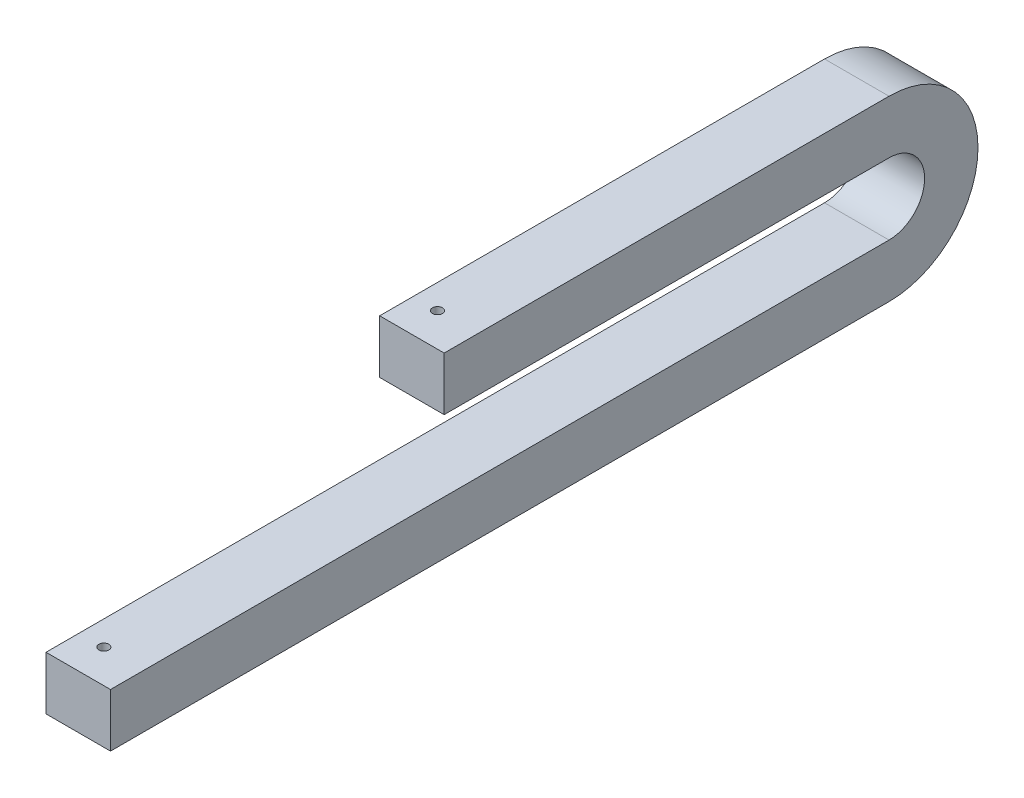
ISO-10303-21;
HEADER;
FILE_DESCRIPTION(('STEP AP214'),'2;1');
FILE_NAME('part.step','',(''),(''),'','','');
FILE_SCHEMA(('AUTOMOTIVE_DESIGN { 1 0 10303 214 1 1 1 1 }'));
ENDSEC;
DATA;
#1=APPLICATION_CONTEXT('core data for automotive mechanical design processes');
#2=APPLICATION_PROTOCOL_DEFINITION('international standard','automotive_design',2000,#1);
#3=PRODUCT_CONTEXT('',#1,'mechanical');
#4=PRODUCT('Part','Part','',(#3));
#5=PRODUCT_RELATED_PRODUCT_CATEGORY('part','',(#4));
#6=PRODUCT_DEFINITION_FORMATION('','',#4);
#7=PRODUCT_DEFINITION_CONTEXT('part definition',#1,'design');
#8=PRODUCT_DEFINITION('design','',#6,#7);
#9=PRODUCT_DEFINITION_SHAPE('','',#8);
#10=(LENGTH_UNIT() NAMED_UNIT(*) SI_UNIT(.MILLI.,.METRE.));
#11=(NAMED_UNIT(*) PLANE_ANGLE_UNIT() SI_UNIT($,.RADIAN.));
#12=(NAMED_UNIT(*) SI_UNIT($,.STERADIAN.) SOLID_ANGLE_UNIT());
#13=UNCERTAINTY_MEASURE_WITH_UNIT(LENGTH_MEASURE(1.E-05),#10,'distance_accuracy_value','');
#14=(GEOMETRIC_REPRESENTATION_CONTEXT(3) GLOBAL_UNCERTAINTY_ASSIGNED_CONTEXT((#13)) GLOBAL_UNIT_ASSIGNED_CONTEXT((#10,
#11,#12)) REPRESENTATION_CONTEXT('',''));
#15=CARTESIAN_POINT('',(0.,0.,0.));
#16=DIRECTION('',(0.,0.,1.));
#17=DIRECTION('',(1.,0.,0.));
#18=AXIS2_PLACEMENT_3D('',#15,#16,#17);
#19=CARTESIAN_POINT('',(29.,0.,0.));
#20=DIRECTION('',(0.,0.,-1.));
#21=DIRECTION('',(0.,1.,0.));
#22=AXIS2_PLACEMENT_3D('',#19,#20,#21);
#23=PLANE('',#22);
#24=DIRECTION('',(0.,-1.,0.));
#25=VECTOR('',#24,1.);
#26=CARTESIAN_POINT('',(0.,0.,0.));
#27=LINE('',#26,#25);
#28=CARTESIAN_POINT('',(0.,0.,0.));
#29=VERTEX_POINT('',#28);
#30=CARTESIAN_POINT('',(0.,-24.,0.));
#31=VERTEX_POINT('',#30);
#32=EDGE_CURVE('E134',#29,#31,#27,.T.);
#33=ORIENTED_EDGE('',*,*,#32,.T.);
#34=DIRECTION('',(-1.,0.,0.));
#35=VECTOR('',#34,1.);
#36=CARTESIAN_POINT('',(29.,-24.,0.));
#37=LINE('',#36,#35);
#38=CARTESIAN_POINT('',(29.,-24.,0.));
#39=VERTEX_POINT('',#38);
#40=EDGE_CURVE('E11',#39,#31,#37,.T.);
#41=ORIENTED_EDGE('',*,*,#40,.F.);
#42=DIRECTION('',(0.,-1.,0.));
#43=VECTOR('',#42,1.);
#44=CARTESIAN_POINT('',(29.,0.,0.));
#45=LINE('',#44,#43);
#46=CARTESIAN_POINT('',(29.,0.,0.));
#47=VERTEX_POINT('',#46);
#48=EDGE_CURVE('E149',#47,#39,#45,.T.);
#49=ORIENTED_EDGE('',*,*,#48,.F.);
#50=DIRECTION('',(-1.,0.,0.));
#51=VECTOR('',#50,1.);
#52=CARTESIAN_POINT('',(29.,0.,0.));
#53=LINE('',#52,#51);
#54=EDGE_CURVE('E130',#47,#29,#53,.T.);
#55=ORIENTED_EDGE('',*,*,#54,.T.);
#56=EDGE_LOOP('',(#33,#41,#49,#55));
#57=FACE_BOUND('',#56,.T.);
#58=ADVANCED_FACE('F37',(#57),#23,.F.);
#59=CARTESIAN_POINT('',(29.,-24.,0.));
#60=DIRECTION('',(0.,1.,0.));
#61=DIRECTION('',(0.,0.,1.));
#62=AXIS2_PLACEMENT_3D('',#59,#60,#61);
#63=PLANE('',#62);
#64=CARTESIAN_POINT('',(11.,-24.,-15.));
#65=DIRECTION('',(0.,1.,0.));
#66=DIRECTION('',(0.,0.,1.));
#67=AXIS2_PLACEMENT_3D('',#64,#65,#66);
#68=CIRCLE('',#67,2.25);
#69=CARTESIAN_POINT('',(11.,-24.,-12.75));
#70=VERTEX_POINT('',#69);
#71=EDGE_CURVE('E138',#70,#70,#68,.T.);
#72=ORIENTED_EDGE('',*,*,#71,.T.);
#73=EDGE_LOOP('',(#72));
#74=FACE_BOUND('',#73,.T.);
#75=DIRECTION('',(0.,0.,-1.));
#76=VECTOR('',#75,1.);
#77=CARTESIAN_POINT('',(0.,-24.,0.));
#78=LINE('',#77,#76);
#79=CARTESIAN_POINT('',(0.,-24.,-350.));
#80=VERTEX_POINT('',#79);
#81=EDGE_CURVE('E137',#31,#80,#78,.T.);
#82=ORIENTED_EDGE('',*,*,#81,.T.);
#83=DIRECTION('',(-1.,0.,0.));
#84=VECTOR('',#83,1.);
#85=CARTESIAN_POINT('',(29.,-24.,-350.));
#86=LINE('',#85,#84);
#87=CARTESIAN_POINT('',(29.,-24.,-350.));
#88=VERTEX_POINT('',#87);
#89=EDGE_CURVE('E46',#88,#80,#86,.T.);
#90=ORIENTED_EDGE('',*,*,#89,.F.);
#91=DIRECTION('',(0.,0.,-1.));
#92=VECTOR('',#91,1.);
#93=CARTESIAN_POINT('',(29.,-24.,0.));
#94=LINE('',#93,#92);
#95=EDGE_CURVE('E97',#39,#88,#94,.T.);
#96=ORIENTED_EDGE('',*,*,#95,.F.);
#97=ORIENTED_EDGE('',*,*,#40,.T.);
#98=EDGE_LOOP('',(#82,#90,#96,#97));
#99=FACE_BOUND('',#98,.T.);
#100=ADVANCED_FACE('F206',(#74,#99),#63,.F.);
#101=CARTESIAN_POINT('',(29.,16.,-350.));
#102=DIRECTION('',(-1.,0.,0.));
#103=DIRECTION('',(0.,0.,1.));
#104=AXIS2_PLACEMENT_3D('',#101,#102,#103);
#105=CYLINDRICAL_SURFACE('',#104,40.);
#106=CARTESIAN_POINT('',(0.,16.,-350.));
#107=DIRECTION('',(1.,0.,0.));
#108=DIRECTION('',(0.,0.,-1.));
#109=AXIS2_PLACEMENT_3D('',#106,#107,#108);
#110=CIRCLE('',#109,40.);
#111=CARTESIAN_POINT('',(0.,56.,-350.));
#112=VERTEX_POINT('',#111);
#113=EDGE_CURVE('E140',#80,#112,#110,.T.);
#114=ORIENTED_EDGE('',*,*,#113,.T.);
#115=DIRECTION('',(-1.,0.,0.));
#116=VECTOR('',#115,1.);
#117=CARTESIAN_POINT('',(29.,56.,-350.));
#118=LINE('',#117,#116);
#119=CARTESIAN_POINT('',(29.,56.,-350.));
#120=VERTEX_POINT('',#119);
#121=EDGE_CURVE('E156',#120,#112,#118,.T.);
#122=ORIENTED_EDGE('',*,*,#121,.F.);
#123=CARTESIAN_POINT('',(29.,16.,-350.));
#124=DIRECTION('',(1.,0.,0.));
#125=DIRECTION('',(0.,0.,-1.));
#126=AXIS2_PLACEMENT_3D('',#123,#124,#125);
#127=CIRCLE('',#126,40.);
#128=EDGE_CURVE('E165',#88,#120,#127,.T.);
#129=ORIENTED_EDGE('',*,*,#128,.F.);
#130=ORIENTED_EDGE('',*,*,#89,.T.);
#131=EDGE_LOOP('',(#114,#122,#129,#130));
#132=FACE_BOUND('',#131,.T.);
#133=ADVANCED_FACE('F163',(#132),#105,.T.);
#134=CARTESIAN_POINT('',(29.,56.,-350.));
#135=DIRECTION('',(0.,-1.,0.));
#136=DIRECTION('',(0.,0.,-1.));
#137=AXIS2_PLACEMENT_3D('',#134,#135,#136);
#138=PLANE('',#137);
#139=CARTESIAN_POINT('',(11.,56.,-165.));
#140=DIRECTION('',(0.,1.,0.));
#141=DIRECTION('',(0.,0.,1.));
#142=AXIS2_PLACEMENT_3D('',#139,#140,#141);
#143=CIRCLE('',#142,2.25);
#144=CARTESIAN_POINT('',(11.,56.,-162.75));
#145=VERTEX_POINT('',#144);
#146=EDGE_CURVE('E188',#145,#145,#143,.T.);
#147=ORIENTED_EDGE('',*,*,#146,.F.);
#148=EDGE_LOOP('',(#147));
#149=FACE_BOUND('',#148,.T.);
#150=DIRECTION('',(0.,0.,1.));
#151=VECTOR('',#150,1.);
#152=CARTESIAN_POINT('',(0.,56.,-350.));
#153=LINE('',#152,#151);
#154=CARTESIAN_POINT('',(0.,56.,-150.));
#155=VERTEX_POINT('',#154);
#156=EDGE_CURVE('E142',#112,#155,#153,.T.);
#157=ORIENTED_EDGE('',*,*,#156,.T.);
#158=DIRECTION('',(-1.,0.,0.));
#159=VECTOR('',#158,1.);
#160=CARTESIAN_POINT('',(29.,56.,-150.));
#161=LINE('',#160,#159);
#162=CARTESIAN_POINT('',(29.,56.,-150.));
#163=VERTEX_POINT('',#162);
#164=EDGE_CURVE('E153',#163,#155,#161,.T.);
#165=ORIENTED_EDGE('',*,*,#164,.F.);
#166=DIRECTION('',(0.,0.,1.));
#167=VECTOR('',#166,1.);
#168=CARTESIAN_POINT('',(29.,56.,-350.));
#169=LINE('',#168,#167);
#170=EDGE_CURVE('E177',#120,#163,#169,.T.);
#171=ORIENTED_EDGE('',*,*,#170,.F.);
#172=ORIENTED_EDGE('',*,*,#121,.T.);
#173=EDGE_LOOP('',(#157,#165,#171,#172));
#174=FACE_BOUND('',#173,.T.);
#175=ADVANCED_FACE('F173',(#149,#174),#138,.F.);
#176=CARTESIAN_POINT('',(29.,56.,-150.));
#177=DIRECTION('',(0.,0.,-1.));
#178=DIRECTION('',(-1.,0.,0.));
#179=AXIS2_PLACEMENT_3D('',#176,#177,#178);
#180=PLANE('',#179);
#181=DIRECTION('',(0.,-1.,0.));
#182=VECTOR('',#181,1.);
#183=CARTESIAN_POINT('',(0.,56.,-150.));
#184=LINE('',#183,#182);
#185=CARTESIAN_POINT('',(0.,32.,-150.));
#186=VERTEX_POINT('',#185);
#187=EDGE_CURVE('E144',#155,#186,#184,.T.);
#188=ORIENTED_EDGE('',*,*,#187,.T.);
#189=DIRECTION('',(-1.,0.,0.));
#190=VECTOR('',#189,1.);
#191=CARTESIAN_POINT('',(29.,32.,-150.));
#192=LINE('',#191,#190);
#193=CARTESIAN_POINT('',(29.,32.,-150.));
#194=VERTEX_POINT('',#193);
#195=EDGE_CURVE('E125',#194,#186,#192,.T.);
#196=ORIENTED_EDGE('',*,*,#195,.F.);
#197=DIRECTION('',(0.,-1.,0.));
#198=VECTOR('',#197,1.);
#199=CARTESIAN_POINT('',(29.,56.,-150.));
#200=LINE('',#199,#198);
#201=EDGE_CURVE('E116',#163,#194,#200,.T.);
#202=ORIENTED_EDGE('',*,*,#201,.F.);
#203=ORIENTED_EDGE('',*,*,#164,.T.);
#204=EDGE_LOOP('',(#188,#196,#202,#203));
#205=FACE_BOUND('',#204,.T.);
#206=ADVANCED_FACE('F176',(#205),#180,.F.);
#207=CARTESIAN_POINT('',(29.,32.,-350.));
#208=DIRECTION('',(0.,1.,0.));
#209=DIRECTION('',(0.,0.,1.));
#210=AXIS2_PLACEMENT_3D('',#207,#208,#209);
#211=PLANE('',#210);
#212=CARTESIAN_POINT('',(11.,32.,-165.));
#213=DIRECTION('',(0.,1.,0.));
#214=DIRECTION('',(0.,0.,1.));
#215=AXIS2_PLACEMENT_3D('',#212,#213,#214);
#216=CIRCLE('',#215,2.25);
#217=CARTESIAN_POINT('',(11.,32.,-162.75));
#218=VERTEX_POINT('',#217);
#219=EDGE_CURVE('E40',#218,#218,#216,.T.);
#220=ORIENTED_EDGE('',*,*,#219,.T.);
#221=EDGE_LOOP('',(#220));
#222=FACE_BOUND('',#221,.T.);
#223=DIRECTION('',(0.,0.,-1.));
#224=VECTOR('',#223,1.);
#225=CARTESIAN_POINT('',(0.,32.,-350.));
#226=LINE('',#225,#224);
#227=CARTESIAN_POINT('',(0.,32.,-350.));
#228=VERTEX_POINT('',#227);
#229=EDGE_CURVE('E124',#186,#228,#226,.T.);
#230=ORIENTED_EDGE('',*,*,#229,.T.);
#231=DIRECTION('',(-1.,0.,0.));
#232=VECTOR('',#231,1.);
#233=CARTESIAN_POINT('',(29.,32.,-350.));
#234=LINE('',#233,#232);
#235=CARTESIAN_POINT('',(29.,32.,-350.));
#236=VERTEX_POINT('',#235);
#237=EDGE_CURVE('E121',#236,#228,#234,.T.);
#238=ORIENTED_EDGE('',*,*,#237,.F.);
#239=DIRECTION('',(0.,0.,-1.));
#240=VECTOR('',#239,1.);
#241=CARTESIAN_POINT('',(29.,32.,-350.));
#242=LINE('',#241,#240);
#243=EDGE_CURVE('E110',#194,#236,#242,.T.);
#244=ORIENTED_EDGE('',*,*,#243,.F.);
#245=ORIENTED_EDGE('',*,*,#195,.T.);
#246=EDGE_LOOP('',(#230,#238,#244,#245));
#247=FACE_BOUND('',#246,.T.);
#248=ADVANCED_FACE('F122',(#222,#247),#211,.F.);
#249=CARTESIAN_POINT('',(29.,16.,-350.));
#250=DIRECTION('',(-1.,0.,0.));
#251=DIRECTION('',(0.,0.,1.));
#252=AXIS2_PLACEMENT_3D('',#249,#250,#251);
#253=CYLINDRICAL_SURFACE('',#252,16.);
#254=CARTESIAN_POINT('',(0.,16.,-350.));
#255=DIRECTION('',(-1.,0.,0.));
#256=DIRECTION('',(0.,0.,-1.));
#257=AXIS2_PLACEMENT_3D('',#254,#255,#256);
#258=CIRCLE('',#257,16.);
#259=CARTESIAN_POINT('',(0.,0.,-350.));
#260=VERTEX_POINT('',#259);
#261=EDGE_CURVE('E83',#228,#260,#258,.T.);
#262=ORIENTED_EDGE('',*,*,#261,.T.);
#263=DIRECTION('',(-1.,0.,0.));
#264=VECTOR('',#263,1.);
#265=CARTESIAN_POINT('',(29.,0.,-350.));
#266=LINE('',#265,#264);
#267=CARTESIAN_POINT('',(29.,0.,-350.));
#268=VERTEX_POINT('',#267);
#269=EDGE_CURVE('E126',#268,#260,#266,.T.);
#270=ORIENTED_EDGE('',*,*,#269,.F.);
#271=CARTESIAN_POINT('',(29.,16.,-350.));
#272=DIRECTION('',(-1.,0.,0.));
#273=DIRECTION('',(0.,0.,-1.));
#274=AXIS2_PLACEMENT_3D('',#271,#272,#273);
#275=CIRCLE('',#274,16.);
#276=EDGE_CURVE('E114',#236,#268,#275,.T.);
#277=ORIENTED_EDGE('',*,*,#276,.F.);
#278=ORIENTED_EDGE('',*,*,#237,.T.);
#279=EDGE_LOOP('',(#262,#270,#277,#278));
#280=FACE_BOUND('',#279,.T.);
#281=ADVANCED_FACE('F128',(#280),#253,.F.);
#282=CARTESIAN_POINT('',(29.,0.,0.));
#283=DIRECTION('',(0.,-1.,0.));
#284=DIRECTION('',(0.,0.,-1.));
#285=AXIS2_PLACEMENT_3D('',#282,#283,#284);
#286=PLANE('',#285);
#287=CARTESIAN_POINT('',(11.,0.,-15.));
#288=DIRECTION('',(0.,1.,0.));
#289=DIRECTION('',(0.,0.,1.));
#290=AXIS2_PLACEMENT_3D('',#287,#288,#289);
#291=CIRCLE('',#290,2.25);
#292=CARTESIAN_POINT('',(11.,0.,-12.75));
#293=VERTEX_POINT('',#292);
#294=EDGE_CURVE('E185',#293,#293,#291,.T.);
#295=ORIENTED_EDGE('',*,*,#294,.F.);
#296=EDGE_LOOP('',(#295));
#297=FACE_BOUND('',#296,.T.);
#298=DIRECTION('',(0.,0.,1.));
#299=VECTOR('',#298,1.);
#300=CARTESIAN_POINT('',(0.,0.,0.));
#301=LINE('',#300,#299);
#302=EDGE_CURVE('E89',#260,#29,#301,.T.);
#303=ORIENTED_EDGE('',*,*,#302,.T.);
#304=ORIENTED_EDGE('',*,*,#54,.F.);
#305=DIRECTION('',(0.,0.,1.));
#306=VECTOR('',#305,1.);
#307=CARTESIAN_POINT('',(29.,0.,0.));
#308=LINE('',#307,#306);
#309=EDGE_CURVE('E54',#268,#47,#308,.T.);
#310=ORIENTED_EDGE('',*,*,#309,.F.);
#311=ORIENTED_EDGE('',*,*,#269,.T.);
#312=EDGE_LOOP('',(#303,#304,#310,#311));
#313=FACE_BOUND('',#312,.T.);
#314=ADVANCED_FACE('F214',(#297,#313),#286,.F.);
#315=CARTESIAN_POINT('',(29.,16.,-350.));
#316=DIRECTION('',(1.,0.,0.));
#317=DIRECTION('',(0.,0.,-1.));
#318=AXIS2_PLACEMENT_3D('',#315,#316,#317);
#319=PLANE('',#318);
#320=ORIENTED_EDGE('',*,*,#48,.T.);
#321=ORIENTED_EDGE('',*,*,#95,.T.);
#322=ORIENTED_EDGE('',*,*,#128,.T.);
#323=ORIENTED_EDGE('',*,*,#170,.T.);
#324=ORIENTED_EDGE('',*,*,#201,.T.);
#325=ORIENTED_EDGE('',*,*,#243,.T.);
#326=ORIENTED_EDGE('',*,*,#276,.T.);
#327=ORIENTED_EDGE('',*,*,#309,.T.);
#328=EDGE_LOOP('',(#320,#321,#322,#323,#324,#325,#326,#327));
#329=FACE_BOUND('',#328,.T.);
#330=ADVANCED_FACE('F112',(#329),#319,.T.);
#331=CARTESIAN_POINT('',(0.,16.,-350.));
#332=DIRECTION('',(1.,0.,0.));
#333=DIRECTION('',(0.,0.,-1.));
#334=AXIS2_PLACEMENT_3D('',#331,#332,#333);
#335=PLANE('',#334);
#336=ORIENTED_EDGE('',*,*,#32,.F.);
#337=ORIENTED_EDGE('',*,*,#302,.F.);
#338=ORIENTED_EDGE('',*,*,#261,.F.);
#339=ORIENTED_EDGE('',*,*,#229,.F.);
#340=ORIENTED_EDGE('',*,*,#187,.F.);
#341=ORIENTED_EDGE('',*,*,#156,.F.);
#342=ORIENTED_EDGE('',*,*,#113,.F.);
#343=ORIENTED_EDGE('',*,*,#81,.F.);
#344=EDGE_LOOP('',(#336,#337,#338,#339,#340,#341,#342,#343));
#345=FACE_BOUND('',#344,.T.);
#346=ADVANCED_FACE('F169',(#345),#335,.F.);
#347=CARTESIAN_POINT('',(11.,-90.,-15.));
#348=DIRECTION('',(0.,1.,0.));
#349=DIRECTION('',(0.,0.,1.));
#350=AXIS2_PLACEMENT_3D('',#347,#348,#349);
#351=CYLINDRICAL_SURFACE('',#350,2.25);
#352=CARTESIAN_POINT('',(11.,0.,-12.75));
#353=CARTESIAN_POINT('',(11.,-0.250000000000014,-12.75));
#354=CARTESIAN_POINT('',(11.,-0.500000000000014,-12.75));
#355=CARTESIAN_POINT('',(11.,-1.00000000000001,-12.75));
#356=CARTESIAN_POINT('',(11.,-1.25000000000002,-12.75));
#357=CARTESIAN_POINT('',(11.,-1.75000000000002,-12.75));
#358=CARTESIAN_POINT('',(11.,-2.00000000000002,-12.75));
#359=CARTESIAN_POINT('',(11.,-2.50000000000002,-12.75));
#360=CARTESIAN_POINT('',(11.,-2.75000000000002,-12.75));
#361=CARTESIAN_POINT('',(11.,-3.25000000000002,-12.75));
#362=CARTESIAN_POINT('',(11.,-3.50000000000002,-12.75));
#363=CARTESIAN_POINT('',(11.,-4.00000000000002,-12.75));
#364=CARTESIAN_POINT('',(11.,-4.25000000000002,-12.75));
#365=CARTESIAN_POINT('',(11.,-4.75000000000002,-12.75));
#366=CARTESIAN_POINT('',(11.,-5.00000000000002,-12.75));
#367=CARTESIAN_POINT('',(11.,-5.50000000000002,-12.75));
#368=CARTESIAN_POINT('',(11.,-5.75000000000002,-12.75));
#369=CARTESIAN_POINT('',(11.,-6.25000000000002,-12.75));
#370=CARTESIAN_POINT('',(11.,-6.50000000000001,-12.75));
#371=CARTESIAN_POINT('',(11.,-7.00000000000001,-12.75));
#372=CARTESIAN_POINT('',(11.,-7.25000000000001,-12.75));
#373=CARTESIAN_POINT('',(11.,-7.75000000000001,-12.75));
#374=CARTESIAN_POINT('',(11.,-8.00000000000001,-12.75));
#375=CARTESIAN_POINT('',(11.,-8.50000000000001,-12.75));
#376=CARTESIAN_POINT('',(11.,-8.75000000000001,-12.75));
#377=CARTESIAN_POINT('',(11.,-9.25000000000001,-12.75));
#378=CARTESIAN_POINT('',(11.,-9.50000000000001,-12.75));
#379=CARTESIAN_POINT('',(11.,-10.,-12.75));
#380=CARTESIAN_POINT('',(11.,-10.25,-12.75));
#381=CARTESIAN_POINT('',(11.,-10.75,-12.75));
#382=CARTESIAN_POINT('',(11.,-11.,-12.75));
#383=CARTESIAN_POINT('',(11.,-11.5,-12.75));
#384=CARTESIAN_POINT('',(11.,-11.75,-12.75));
#385=CARTESIAN_POINT('',(11.,-12.25,-12.75));
#386=CARTESIAN_POINT('',(11.,-12.5,-12.75));
#387=CARTESIAN_POINT('',(11.,-13.,-12.75));
#388=CARTESIAN_POINT('',(11.,-13.25,-12.75));
#389=CARTESIAN_POINT('',(11.,-13.75,-12.75));
#390=CARTESIAN_POINT('',(11.,-14.,-12.75));
#391=CARTESIAN_POINT('',(11.,-14.5,-12.75));
#392=CARTESIAN_POINT('',(11.,-14.75,-12.75));
#393=CARTESIAN_POINT('',(11.,-15.25,-12.75));
#394=CARTESIAN_POINT('',(11.,-15.5,-12.75));
#395=CARTESIAN_POINT('',(11.,-16.,-12.75));
#396=CARTESIAN_POINT('',(11.,-16.25,-12.75));
#397=CARTESIAN_POINT('',(11.,-16.75,-12.75));
#398=CARTESIAN_POINT('',(11.,-17.,-12.75));
#399=CARTESIAN_POINT('',(11.,-17.5,-12.75));
#400=CARTESIAN_POINT('',(11.,-17.75,-12.75));
#401=CARTESIAN_POINT('',(11.,-18.25,-12.75));
#402=CARTESIAN_POINT('',(11.,-18.5,-12.75));
#403=CARTESIAN_POINT('',(11.,-19.,-12.75));
#404=CARTESIAN_POINT('',(11.,-19.25,-12.75));
#405=CARTESIAN_POINT('',(11.,-19.75,-12.75));
#406=CARTESIAN_POINT('',(11.,-20.,-12.75));
#407=CARTESIAN_POINT('',(11.,-20.5,-12.75));
#408=CARTESIAN_POINT('',(11.,-20.75,-12.75));
#409=CARTESIAN_POINT('',(11.,-21.25,-12.75));
#410=CARTESIAN_POINT('',(11.,-21.5,-12.75));
#411=CARTESIAN_POINT('',(11.,-22.,-12.75));
#412=CARTESIAN_POINT('',(11.,-22.25,-12.75));
#413=CARTESIAN_POINT('',(11.,-22.75,-12.75));
#414=CARTESIAN_POINT('',(11.,-23.,-12.75));
#415=CARTESIAN_POINT('',(11.,-23.5,-12.75));
#416=CARTESIAN_POINT('',(11.,-23.75,-12.75));
#417=CARTESIAN_POINT('',(11.,-24.,-12.75));
#418=B_SPLINE_CURVE_WITH_KNOTS('',3,(#352,#353,#354,#355,#356,#357,#358,#359,#360,#361,#362,
#363,#364,#365,#366,#367,#368,#369,#370,#371,#372,#373,#374,#375,#376,#377,#378,#379,#380,#381,
#382,#383,#384,#385,#386,#387,#388,#389,#390,#391,#392,#393,#394,#395,#396,#397,#398,#399,#400,
#401,#402,#403,#404,#405,#406,#407,#408,#409,#410,#411,#412,#413,#414,#415,#416,#417),
.UNSPECIFIED.,.F.,.F.,(4,2,2,2,2,2,2,2,2,2,2,2,2,2,2,2,2,2,2,2,2,2,2,2,2,2,2,2,2,2,2,2,4),(0.,
0.750000000000001,1.5,2.25,3.,3.75,4.5,5.25,6.00000000000001,6.74999999999999,7.49999999999999,
8.24999999999999,8.99999999999999,9.74999999999999,10.5,11.25,12.,12.75,13.5,14.25,15.,15.75,
16.5,17.25,18.,18.75,19.5,20.25,21.,21.75,22.5,23.25,24.),.UNSPECIFIED.);
#419=EDGE_CURVE('BSEAM198',#293,#70,#418,.T.);
#420=ORIENTED_EDGE('',*,*,#294,.T.);
#421=ORIENTED_EDGE('',*,*,#71,.F.);
#422=ORIENTED_EDGE('',*,*,#419,.T.);
#423=ORIENTED_EDGE('',*,*,#419,.F.);
#424=EDGE_LOOP('',(#420,#422,#421,#423));
#425=FACE_BOUND('',#424,.T.);
#426=ADVANCED_FACE('F198',(#425),#351,.F.);
#427=CARTESIAN_POINT('',(11.,16.,-165.));
#428=DIRECTION('',(0.,1.,0.));
#429=DIRECTION('',(0.,0.,1.));
#430=AXIS2_PLACEMENT_3D('',#427,#428,#429);
#431=CYLINDRICAL_SURFACE('',#430,2.25);
#432=ORIENTED_EDGE('',*,*,#146,.T.);
#433=EDGE_LOOP('',(#432));
#434=FACE_BOUND('',#433,.T.);
#435=ORIENTED_EDGE('',*,*,#219,.F.);
#436=EDGE_LOOP('',(#435));
#437=FACE_BOUND('',#436,.T.);
#438=ADVANCED_FACE('F196',(#434,#437),#431,.F.);
#439=CLOSED_SHELL('',(#58,#100,#133,#175,#206,#248,#281,#314,#330,#346,#426,#438));
#440=MANIFOLD_SOLID_BREP('B2',#439);
#441=ADVANCED_BREP_SHAPE_REPRESENTATION('',(#18,#440),#14);
#442=SHAPE_DEFINITION_REPRESENTATION(#9,#441);
ENDSEC;
END-ISO-10303-21;
